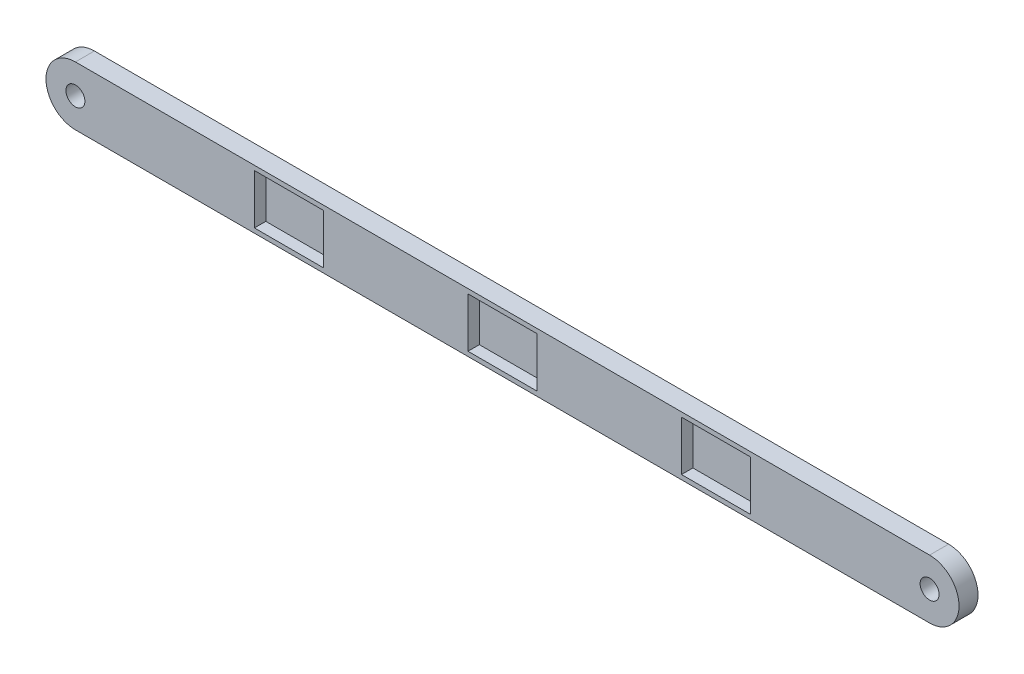
ISO-10303-21;
HEADER;
FILE_DESCRIPTION(('STEP AP214'),'2;1');
FILE_NAME('part.step','',(''),(''),'','','');
FILE_SCHEMA(('AUTOMOTIVE_DESIGN { 1 0 10303 214 1 1 1 1 }'));
ENDSEC;
DATA;
#1=APPLICATION_CONTEXT('core data for automotive mechanical design processes');
#2=APPLICATION_PROTOCOL_DEFINITION('international standard','automotive_design',2000,#1);
#3=PRODUCT_CONTEXT('',#1,'mechanical');
#4=PRODUCT('Part','Part','',(#3));
#5=PRODUCT_RELATED_PRODUCT_CATEGORY('part','',(#4));
#6=PRODUCT_DEFINITION_FORMATION('','',#4);
#7=PRODUCT_DEFINITION_CONTEXT('part definition',#1,'design');
#8=PRODUCT_DEFINITION('design','',#6,#7);
#9=PRODUCT_DEFINITION_SHAPE('','',#8);
#10=(LENGTH_UNIT() NAMED_UNIT(*) SI_UNIT(.MILLI.,.METRE.));
#11=(NAMED_UNIT(*) PLANE_ANGLE_UNIT() SI_UNIT($,.RADIAN.));
#12=(NAMED_UNIT(*) SI_UNIT($,.STERADIAN.) SOLID_ANGLE_UNIT());
#13=UNCERTAINTY_MEASURE_WITH_UNIT(LENGTH_MEASURE(1.E-05),#10,'distance_accuracy_value','');
#14=(GEOMETRIC_REPRESENTATION_CONTEXT(3) GLOBAL_UNCERTAINTY_ASSIGNED_CONTEXT((#13)) GLOBAL_UNIT_ASSIGNED_CONTEXT((#10,
#11,#12)) REPRESENTATION_CONTEXT('',''));
#15=CARTESIAN_POINT('',(0.,0.,0.));
#16=DIRECTION('',(0.,0.,1.));
#17=DIRECTION('',(1.,0.,0.));
#18=AXIS2_PLACEMENT_3D('',#15,#16,#17);
#19=CARTESIAN_POINT('',(-112.5,0.,2.5));
#20=DIRECTION('',(0.,0.,1.));
#21=DIRECTION('',(1.,0.,0.));
#22=AXIS2_PLACEMENT_3D('',#19,#20,#21);
#23=PLANE('',#22);
#24=DIRECTION('',(0.,-1.,0.));
#25=VECTOR('',#24,1.);
#26=CARTESIAN_POINT('',(-65.35,6.55,2.5));
#27=LINE('',#26,#25);
#28=CARTESIAN_POINT('',(-65.35,6.55,2.5));
#29=VERTEX_POINT('',#28);
#30=CARTESIAN_POINT('',(-65.35,-6.55,2.5));
#31=VERTEX_POINT('',#30);
#32=EDGE_CURVE('E58',#29,#31,#27,.T.);
#33=ORIENTED_EDGE('',*,*,#32,.F.);
#34=DIRECTION('',(1.,0.,0.));
#35=VECTOR('',#34,1.);
#36=CARTESIAN_POINT('',(-65.35,6.55,2.5));
#37=LINE('',#36,#35);
#38=CARTESIAN_POINT('',(-47.15,6.55,2.5));
#39=VERTEX_POINT('',#38);
#40=EDGE_CURVE('E176',#29,#39,#37,.T.);
#41=ORIENTED_EDGE('',*,*,#40,.T.);
#42=DIRECTION('',(0.,-1.,0.));
#43=VECTOR('',#42,1.);
#44=CARTESIAN_POINT('',(-47.15,6.55,2.5));
#45=LINE('',#44,#43);
#46=CARTESIAN_POINT('',(-47.15,-6.55,2.5));
#47=VERTEX_POINT('',#46);
#48=EDGE_CURVE('E179',#39,#47,#45,.T.);
#49=ORIENTED_EDGE('',*,*,#48,.T.);
#50=DIRECTION('',(1.,0.,0.));
#51=VECTOR('',#50,1.);
#52=CARTESIAN_POINT('',(-65.35,-6.55,2.5));
#53=LINE('',#52,#51);
#54=EDGE_CURVE('E185',#31,#47,#53,.T.);
#55=ORIENTED_EDGE('',*,*,#54,.F.);
#56=EDGE_LOOP('',(#33,#41,#49,#55));
#57=FACE_BOUND('',#56,.T.);
#58=DIRECTION('',(1.,0.,0.));
#59=VECTOR('',#58,1.);
#60=CARTESIAN_POINT('',(-9.1,-6.55,2.5));
#61=LINE('',#60,#59);
#62=CARTESIAN_POINT('',(-9.1,-6.55,2.5));
#63=VERTEX_POINT('',#62);
#64=CARTESIAN_POINT('',(9.1,-6.55,2.5));
#65=VERTEX_POINT('',#64);
#66=EDGE_CURVE('E66',#63,#65,#61,.T.);
#67=ORIENTED_EDGE('',*,*,#66,.F.);
#68=DIRECTION('',(0.,-1.,0.));
#69=VECTOR('',#68,1.);
#70=CARTESIAN_POINT('',(-9.1,6.55,2.5));
#71=LINE('',#70,#69);
#72=CARTESIAN_POINT('',(-9.1,6.55,2.5));
#73=VERTEX_POINT('',#72);
#74=EDGE_CURVE('E205',#73,#63,#71,.T.);
#75=ORIENTED_EDGE('',*,*,#74,.F.);
#76=DIRECTION('',(1.,0.,0.));
#77=VECTOR('',#76,1.);
#78=CARTESIAN_POINT('',(-9.1,6.55,2.5));
#79=LINE('',#78,#77);
#80=CARTESIAN_POINT('',(9.1,6.55,2.5));
#81=VERTEX_POINT('',#80);
#82=EDGE_CURVE('E208',#73,#81,#79,.T.);
#83=ORIENTED_EDGE('',*,*,#82,.T.);
#84=DIRECTION('',(0.,-1.,0.));
#85=VECTOR('',#84,1.);
#86=CARTESIAN_POINT('',(9.1,6.55,2.5));
#87=LINE('',#86,#85);
#88=EDGE_CURVE('E212',#81,#65,#87,.T.);
#89=ORIENTED_EDGE('',*,*,#88,.T.);
#90=EDGE_LOOP('',(#67,#75,#83,#89));
#91=FACE_BOUND('',#90,.T.);
#92=DIRECTION('',(1.,0.,0.));
#93=VECTOR('',#92,1.);
#94=CARTESIAN_POINT('',(47.15,-6.55,2.5));
#95=LINE('',#94,#93);
#96=CARTESIAN_POINT('',(47.15,-6.55,2.5));
#97=VERTEX_POINT('',#96);
#98=CARTESIAN_POINT('',(65.35,-6.55,2.5));
#99=VERTEX_POINT('',#98);
#100=EDGE_CURVE('E204',#97,#99,#95,.T.);
#101=ORIENTED_EDGE('',*,*,#100,.F.);
#102=DIRECTION('',(0.,-1.,0.));
#103=VECTOR('',#102,1.);
#104=CARTESIAN_POINT('',(47.15,6.55,2.5));
#105=LINE('',#104,#103);
#106=CARTESIAN_POINT('',(47.15,6.55,2.5));
#107=VERTEX_POINT('',#106);
#108=EDGE_CURVE('E234',#107,#97,#105,.T.);
#109=ORIENTED_EDGE('',*,*,#108,.F.);
#110=DIRECTION('',(1.,0.,0.));
#111=VECTOR('',#110,1.);
#112=CARTESIAN_POINT('',(47.15,6.55,2.5));
#113=LINE('',#112,#111);
#114=CARTESIAN_POINT('',(65.35,6.55,2.5));
#115=VERTEX_POINT('',#114);
#116=EDGE_CURVE('E237',#107,#115,#113,.T.);
#117=ORIENTED_EDGE('',*,*,#116,.T.);
#118=DIRECTION('',(0.,-1.,0.));
#119=VECTOR('',#118,1.);
#120=CARTESIAN_POINT('',(65.35,6.55,2.5));
#121=LINE('',#120,#119);
#122=EDGE_CURVE('E241',#115,#99,#121,.T.);
#123=ORIENTED_EDGE('',*,*,#122,.T.);
#124=EDGE_LOOP('',(#101,#109,#117,#123));
#125=FACE_BOUND('',#124,.T.);
#126=CARTESIAN_POINT('',(112.5,0.,2.5));
#127=DIRECTION('',(0.,0.,1.));
#128=DIRECTION('',(1.,0.,0.));
#129=AXIS2_PLACEMENT_3D('',#126,#127,#128);
#130=CIRCLE('',#129,2.49999999999999);
#131=CARTESIAN_POINT('',(115.,0.,2.5));
#132=VERTEX_POINT('',#131);
#133=EDGE_CURVE('E259',#132,#132,#130,.T.);
#134=ORIENTED_EDGE('',*,*,#133,.F.);
#135=EDGE_LOOP('',(#134));
#136=FACE_BOUND('',#135,.T.);
#137=CARTESIAN_POINT('',(-112.5,0.,2.5));
#138=DIRECTION('',(0.,0.,1.));
#139=DIRECTION('',(1.,0.,0.));
#140=AXIS2_PLACEMENT_3D('',#137,#138,#139);
#141=CIRCLE('',#140,7.75);
#142=CARTESIAN_POINT('',(-112.5,7.75,2.5));
#143=VERTEX_POINT('',#142);
#144=CARTESIAN_POINT('',(-112.5,-7.75,2.5));
#145=VERTEX_POINT('',#144);
#146=EDGE_CURVE('E265',#143,#145,#141,.T.);
#147=ORIENTED_EDGE('',*,*,#146,.T.);
#148=DIRECTION('',(1.,0.,0.));
#149=VECTOR('',#148,1.);
#150=CARTESIAN_POINT('',(-112.5,-7.75,2.5));
#151=LINE('',#150,#149);
#152=CARTESIAN_POINT('',(112.5,-7.74999999999996,2.5));
#153=VERTEX_POINT('',#152);
#154=EDGE_CURVE('E268',#145,#153,#151,.T.);
#155=ORIENTED_EDGE('',*,*,#154,.T.);
#156=CARTESIAN_POINT('',(112.5,0.,2.5));
#157=DIRECTION('',(0.,0.,1.));
#158=DIRECTION('',(1.,0.,0.));
#159=AXIS2_PLACEMENT_3D('',#156,#157,#158);
#160=CIRCLE('',#159,7.75);
#161=CARTESIAN_POINT('',(112.5,7.75,2.5));
#162=VERTEX_POINT('',#161);
#163=EDGE_CURVE('E271',#153,#162,#160,.T.);
#164=ORIENTED_EDGE('',*,*,#163,.T.);
#165=DIRECTION('',(-1.,0.,0.));
#166=VECTOR('',#165,1.);
#167=CARTESIAN_POINT('',(-112.5,7.75,2.5));
#168=LINE('',#167,#166);
#169=EDGE_CURVE('E273',#162,#143,#168,.T.);
#170=ORIENTED_EDGE('',*,*,#169,.T.);
#171=EDGE_LOOP('',(#147,#155,#164,#170));
#172=FACE_BOUND('',#171,.T.);
#173=CARTESIAN_POINT('',(-112.5,0.,2.5));
#174=DIRECTION('',(0.,0.,1.));
#175=DIRECTION('',(1.,0.,0.));
#176=AXIS2_PLACEMENT_3D('',#173,#174,#175);
#177=CIRCLE('',#176,2.50000000000001);
#178=CARTESIAN_POINT('',(-110.,0.,2.5));
#179=VERTEX_POINT('',#178);
#180=EDGE_CURVE('E253',#179,#179,#177,.T.);
#181=ORIENTED_EDGE('',*,*,#180,.F.);
#182=EDGE_LOOP('',(#181));
#183=FACE_BOUND('',#182,.T.);
#184=ADVANCED_FACE('F43',(#57,#91,#125,#136,#172,#183),#23,.T.);
#185=CARTESIAN_POINT('',(-112.5,0.,-2.5));
#186=DIRECTION('',(0.,0.,1.));
#187=DIRECTION('',(1.,0.,0.));
#188=AXIS2_PLACEMENT_3D('',#185,#186,#187);
#189=PLANE('',#188);
#190=CARTESIAN_POINT('',(-112.5,0.,-2.5));
#191=DIRECTION('',(0.,0.,1.));
#192=DIRECTION('',(1.,0.,0.));
#193=AXIS2_PLACEMENT_3D('',#190,#191,#192);
#194=CIRCLE('',#193,7.75);
#195=CARTESIAN_POINT('',(-112.5,7.75,-2.5));
#196=VERTEX_POINT('',#195);
#197=CARTESIAN_POINT('',(-112.5,-7.75,-2.5));
#198=VERTEX_POINT('',#197);
#199=EDGE_CURVE('E262',#196,#198,#194,.T.);
#200=ORIENTED_EDGE('',*,*,#199,.F.);
#201=DIRECTION('',(-1.,0.,0.));
#202=VECTOR('',#201,1.);
#203=CARTESIAN_POINT('',(-112.5,7.75,-2.5));
#204=LINE('',#203,#202);
#205=CARTESIAN_POINT('',(112.5,7.75,-2.5));
#206=VERTEX_POINT('',#205);
#207=EDGE_CURVE('E269',#206,#196,#204,.T.);
#208=ORIENTED_EDGE('',*,*,#207,.F.);
#209=CARTESIAN_POINT('',(112.5,0.,-2.5));
#210=DIRECTION('',(0.,0.,1.));
#211=DIRECTION('',(1.,0.,0.));
#212=AXIS2_PLACEMENT_3D('',#209,#210,#211);
#213=CIRCLE('',#212,7.75);
#214=CARTESIAN_POINT('',(112.5,-7.74999999999996,-2.5));
#215=VERTEX_POINT('',#214);
#216=EDGE_CURVE('E280',#215,#206,#213,.T.);
#217=ORIENTED_EDGE('',*,*,#216,.F.);
#218=DIRECTION('',(1.,0.,0.));
#219=VECTOR('',#218,1.);
#220=CARTESIAN_POINT('',(-112.5,-7.75,-2.5));
#221=LINE('',#220,#219);
#222=EDGE_CURVE('E278',#198,#215,#221,.T.);
#223=ORIENTED_EDGE('',*,*,#222,.F.);
#224=EDGE_LOOP('',(#200,#208,#217,#223));
#225=FACE_BOUND('',#224,.T.);
#226=CARTESIAN_POINT('',(112.5,0.,-2.5));
#227=DIRECTION('',(0.,0.,1.));
#228=DIRECTION('',(1.,0.,0.));
#229=AXIS2_PLACEMENT_3D('',#226,#227,#228);
#230=CIRCLE('',#229,2.49999999999999);
#231=CARTESIAN_POINT('',(115.,0.,-2.5));
#232=VERTEX_POINT('',#231);
#233=EDGE_CURVE('E256',#232,#232,#230,.T.);
#234=ORIENTED_EDGE('',*,*,#233,.T.);
#235=EDGE_LOOP('',(#234));
#236=FACE_BOUND('',#235,.T.);
#237=CARTESIAN_POINT('',(-112.5,0.,-2.5));
#238=DIRECTION('',(0.,0.,1.));
#239=DIRECTION('',(1.,0.,0.));
#240=AXIS2_PLACEMENT_3D('',#237,#238,#239);
#241=CIRCLE('',#240,2.50000000000001);
#242=CARTESIAN_POINT('',(-110.,0.,-2.5));
#243=VERTEX_POINT('',#242);
#244=EDGE_CURVE('E191',#243,#243,#241,.T.);
#245=ORIENTED_EDGE('',*,*,#244,.T.);
#246=EDGE_LOOP('',(#245));
#247=FACE_BOUND('',#246,.T.);
#248=ADVANCED_FACE('F298',(#225,#236,#247),#189,.F.);
#249=CARTESIAN_POINT('',(-112.5,0.,2.5));
#250=DIRECTION('',(0.,0.,-1.));
#251=DIRECTION('',(-1.,0.,0.));
#252=AXIS2_PLACEMENT_3D('',#249,#250,#251);
#253=CYLINDRICAL_SURFACE('',#252,7.75);
#254=ORIENTED_EDGE('',*,*,#199,.T.);
#255=DIRECTION('',(0.,0.,-1.));
#256=VECTOR('',#255,1.);
#257=CARTESIAN_POINT('',(-112.5,-7.75,2.5));
#258=LINE('',#257,#256);
#259=EDGE_CURVE('E11',#145,#198,#258,.T.);
#260=ORIENTED_EDGE('',*,*,#259,.F.);
#261=ORIENTED_EDGE('',*,*,#146,.F.);
#262=DIRECTION('',(0.,0.,-1.));
#263=VECTOR('',#262,1.);
#264=CARTESIAN_POINT('',(-112.5,7.75,2.5));
#265=LINE('',#264,#263);
#266=EDGE_CURVE('E275',#143,#196,#265,.T.);
#267=ORIENTED_EDGE('',*,*,#266,.T.);
#268=EDGE_LOOP('',(#254,#260,#261,#267));
#269=FACE_BOUND('',#268,.T.);
#270=ADVANCED_FACE('F45',(#269),#253,.T.);
#271=CARTESIAN_POINT('',(-112.5,-7.75,2.5));
#272=DIRECTION('',(0.,1.,0.));
#273=DIRECTION('',(0.,0.,1.));
#274=AXIS2_PLACEMENT_3D('',#271,#272,#273);
#275=PLANE('',#274);
#276=ORIENTED_EDGE('',*,*,#222,.T.);
#277=DIRECTION('',(0.,0.,-1.));
#278=VECTOR('',#277,1.);
#279=CARTESIAN_POINT('',(112.5,-7.74999999999996,2.5));
#280=LINE('',#279,#278);
#281=EDGE_CURVE('E51',#153,#215,#280,.T.);
#282=ORIENTED_EDGE('',*,*,#281,.F.);
#283=ORIENTED_EDGE('',*,*,#154,.F.);
#284=ORIENTED_EDGE('',*,*,#259,.T.);
#285=EDGE_LOOP('',(#276,#282,#283,#284));
#286=FACE_BOUND('',#285,.T.);
#287=ADVANCED_FACE('F309',(#286),#275,.F.);
#288=CARTESIAN_POINT('',(112.5,0.,2.5));
#289=DIRECTION('',(0.,0.,-1.));
#290=DIRECTION('',(-1.,0.,0.));
#291=AXIS2_PLACEMENT_3D('',#288,#289,#290);
#292=CYLINDRICAL_SURFACE('',#291,7.75);
#293=ORIENTED_EDGE('',*,*,#216,.T.);
#294=DIRECTION('',(0.,0.,-1.));
#295=VECTOR('',#294,1.);
#296=CARTESIAN_POINT('',(112.5,7.75,2.5));
#297=LINE('',#296,#295);
#298=EDGE_CURVE('E285',#162,#206,#297,.T.);
#299=ORIENTED_EDGE('',*,*,#298,.F.);
#300=ORIENTED_EDGE('',*,*,#163,.F.);
#301=ORIENTED_EDGE('',*,*,#281,.T.);
#302=EDGE_LOOP('',(#293,#299,#300,#301));
#303=FACE_BOUND('',#302,.T.);
#304=ADVANCED_FACE('F292',(#303),#292,.T.);
#305=CARTESIAN_POINT('',(-112.5,7.75,2.5));
#306=DIRECTION('',(0.,-1.,0.));
#307=DIRECTION('',(0.,0.,-1.));
#308=AXIS2_PLACEMENT_3D('',#305,#306,#307);
#309=PLANE('',#308);
#310=ORIENTED_EDGE('',*,*,#207,.T.);
#311=ORIENTED_EDGE('',*,*,#266,.F.);
#312=ORIENTED_EDGE('',*,*,#169,.F.);
#313=ORIENTED_EDGE('',*,*,#298,.T.);
#314=EDGE_LOOP('',(#310,#311,#312,#313));
#315=FACE_BOUND('',#314,.T.);
#316=ADVANCED_FACE('F302',(#315),#309,.F.);
#317=CARTESIAN_POINT('',(112.5,0.,2.5));
#318=DIRECTION('',(0.,0.,-1.));
#319=DIRECTION('',(-1.,0.,0.));
#320=AXIS2_PLACEMENT_3D('',#317,#318,#319);
#321=CYLINDRICAL_SURFACE('',#320,2.49999999999999);
#322=ORIENTED_EDGE('',*,*,#133,.T.);
#323=EDGE_LOOP('',(#322));
#324=FACE_BOUND('',#323,.T.);
#325=ORIENTED_EDGE('',*,*,#233,.F.);
#326=EDGE_LOOP('',(#325));
#327=FACE_BOUND('',#326,.T.);
#328=ADVANCED_FACE('F327',(#324,#327),#321,.F.);
#329=CARTESIAN_POINT('',(-112.5,0.,2.5));
#330=DIRECTION('',(0.,0.,-1.));
#331=DIRECTION('',(-1.,0.,0.));
#332=AXIS2_PLACEMENT_3D('',#329,#330,#331);
#333=CYLINDRICAL_SURFACE('',#332,2.50000000000001);
#334=ORIENTED_EDGE('',*,*,#180,.T.);
#335=EDGE_LOOP('',(#334));
#336=FACE_BOUND('',#335,.T.);
#337=ORIENTED_EDGE('',*,*,#244,.F.);
#338=EDGE_LOOP('',(#337));
#339=FACE_BOUND('',#338,.T.);
#340=ADVANCED_FACE('F334',(#336,#339),#333,.F.);
#341=CARTESIAN_POINT('',(47.15,-6.55,-0.5));
#342=DIRECTION('',(0.,-1.,0.));
#343=DIRECTION('',(0.,0.,-1.));
#344=AXIS2_PLACEMENT_3D('',#341,#342,#343);
#345=PLANE('',#344);
#346=ORIENTED_EDGE('',*,*,#100,.T.);
#347=DIRECTION('',(0.,0.,1.));
#348=VECTOR('',#347,1.);
#349=CARTESIAN_POINT('',(65.35,-6.55,-0.5));
#350=LINE('',#349,#348);
#351=CARTESIAN_POINT('',(65.35,-6.55,-0.5));
#352=VERTEX_POINT('',#351);
#353=EDGE_CURVE('E224',#352,#99,#350,.T.);
#354=ORIENTED_EDGE('',*,*,#353,.F.);
#355=DIRECTION('',(1.,0.,0.));
#356=VECTOR('',#355,1.);
#357=CARTESIAN_POINT('',(47.15,-6.55,-0.5));
#358=LINE('',#357,#356);
#359=CARTESIAN_POINT('',(47.15,-6.55,-0.5));
#360=VERTEX_POINT('',#359);
#361=EDGE_CURVE('E238',#360,#352,#358,.T.);
#362=ORIENTED_EDGE('',*,*,#361,.F.);
#363=DIRECTION('',(0.,0.,1.));
#364=VECTOR('',#363,1.);
#365=CARTESIAN_POINT('',(47.15,-6.55,-0.5));
#366=LINE('',#365,#364);
#367=EDGE_CURVE('E232',#360,#97,#366,.T.);
#368=ORIENTED_EDGE('',*,*,#367,.T.);
#369=EDGE_LOOP('',(#346,#354,#362,#368));
#370=FACE_BOUND('',#369,.T.);
#371=ADVANCED_FACE('F338',(#370),#345,.F.);
#372=CARTESIAN_POINT('',(47.15,6.55,-0.5));
#373=DIRECTION('',(-1.,0.,0.));
#374=DIRECTION('',(0.,0.,1.));
#375=AXIS2_PLACEMENT_3D('',#372,#373,#374);
#376=PLANE('',#375);
#377=ORIENTED_EDGE('',*,*,#108,.T.);
#378=ORIENTED_EDGE('',*,*,#367,.F.);
#379=DIRECTION('',(0.,-1.,0.));
#380=VECTOR('',#379,1.);
#381=CARTESIAN_POINT('',(47.15,6.55,-0.5));
#382=LINE('',#381,#380);
#383=CARTESIAN_POINT('',(47.15,6.55,-0.5));
#384=VERTEX_POINT('',#383);
#385=EDGE_CURVE('E227',#384,#360,#382,.T.);
#386=ORIENTED_EDGE('',*,*,#385,.F.);
#387=DIRECTION('',(0.,0.,1.));
#388=VECTOR('',#387,1.);
#389=CARTESIAN_POINT('',(47.15,6.55,-0.5));
#390=LINE('',#389,#388);
#391=EDGE_CURVE('E230',#384,#107,#390,.T.);
#392=ORIENTED_EDGE('',*,*,#391,.T.);
#393=EDGE_LOOP('',(#377,#378,#386,#392));
#394=FACE_BOUND('',#393,.T.);
#395=ADVANCED_FACE('F349',(#394),#376,.F.);
#396=CARTESIAN_POINT('',(47.15,6.55,-0.5));
#397=DIRECTION('',(0.,-1.,0.));
#398=DIRECTION('',(0.,0.,-1.));
#399=AXIS2_PLACEMENT_3D('',#396,#397,#398);
#400=PLANE('',#399);
#401=ORIENTED_EDGE('',*,*,#116,.F.);
#402=ORIENTED_EDGE('',*,*,#391,.F.);
#403=DIRECTION('',(1.,0.,0.));
#404=VECTOR('',#403,1.);
#405=CARTESIAN_POINT('',(47.15,6.55,-0.5));
#406=LINE('',#405,#404);
#407=CARTESIAN_POINT('',(65.35,6.55,-0.5));
#408=VERTEX_POINT('',#407);
#409=EDGE_CURVE('E247',#384,#408,#406,.T.);
#410=ORIENTED_EDGE('',*,*,#409,.T.);
#411=DIRECTION('',(0.,0.,1.));
#412=VECTOR('',#411,1.);
#413=CARTESIAN_POINT('',(65.35,6.55,-0.5));
#414=LINE('',#413,#412);
#415=EDGE_CURVE('E228',#408,#115,#414,.T.);
#416=ORIENTED_EDGE('',*,*,#415,.T.);
#417=EDGE_LOOP('',(#401,#402,#410,#416));
#418=FACE_BOUND('',#417,.T.);
#419=ADVANCED_FACE('F361',(#418),#400,.T.);
#420=CARTESIAN_POINT('',(65.35,6.55,-0.5));
#421=DIRECTION('',(-1.,0.,0.));
#422=DIRECTION('',(0.,0.,1.));
#423=AXIS2_PLACEMENT_3D('',#420,#421,#422);
#424=PLANE('',#423);
#425=ORIENTED_EDGE('',*,*,#122,.F.);
#426=ORIENTED_EDGE('',*,*,#415,.F.);
#427=DIRECTION('',(0.,-1.,0.));
#428=VECTOR('',#427,1.);
#429=CARTESIAN_POINT('',(65.35,6.55,-0.5));
#430=LINE('',#429,#428);
#431=EDGE_CURVE('E249',#408,#352,#430,.T.);
#432=ORIENTED_EDGE('',*,*,#431,.T.);
#433=ORIENTED_EDGE('',*,*,#353,.T.);
#434=EDGE_LOOP('',(#425,#426,#432,#433));
#435=FACE_BOUND('',#434,.T.);
#436=ADVANCED_FACE('F357',(#435),#424,.T.);
#437=CARTESIAN_POINT('',(0.,0.,-0.5));
#438=DIRECTION('',(0.,0.,-1.));
#439=DIRECTION('',(-1.,0.,0.));
#440=AXIS2_PLACEMENT_3D('',#437,#438,#439);
#441=PLANE('',#440);
#442=ORIENTED_EDGE('',*,*,#361,.T.);
#443=ORIENTED_EDGE('',*,*,#431,.F.);
#444=ORIENTED_EDGE('',*,*,#409,.F.);
#445=ORIENTED_EDGE('',*,*,#385,.T.);
#446=EDGE_LOOP('',(#442,#443,#444,#445));
#447=FACE_BOUND('',#446,.T.);
#448=ADVANCED_FACE('F353',(#447),#441,.F.);
#449=CARTESIAN_POINT('',(-9.1,-6.55,-0.5));
#450=DIRECTION('',(0.,-1.,0.));
#451=DIRECTION('',(0.,0.,-1.));
#452=AXIS2_PLACEMENT_3D('',#449,#450,#451);
#453=PLANE('',#452);
#454=ORIENTED_EDGE('',*,*,#66,.T.);
#455=DIRECTION('',(0.,0.,1.));
#456=VECTOR('',#455,1.);
#457=CARTESIAN_POINT('',(9.1,-6.55,-0.5));
#458=LINE('',#457,#456);
#459=CARTESIAN_POINT('',(9.1,-6.55,-0.5));
#460=VERTEX_POINT('',#459);
#461=EDGE_CURVE('E195',#460,#65,#458,.T.);
#462=ORIENTED_EDGE('',*,*,#461,.F.);
#463=DIRECTION('',(1.,0.,0.));
#464=VECTOR('',#463,1.);
#465=CARTESIAN_POINT('',(-9.1,-6.55,-0.5));
#466=LINE('',#465,#464);
#467=CARTESIAN_POINT('',(-9.1,-6.55,-0.5));
#468=VERTEX_POINT('',#467);
#469=EDGE_CURVE('E209',#468,#460,#466,.T.);
#470=ORIENTED_EDGE('',*,*,#469,.F.);
#471=DIRECTION('',(0.,0.,1.));
#472=VECTOR('',#471,1.);
#473=CARTESIAN_POINT('',(-9.1,-6.55,-0.5));
#474=LINE('',#473,#472);
#475=EDGE_CURVE('E202',#468,#63,#474,.T.);
#476=ORIENTED_EDGE('',*,*,#475,.T.);
#477=EDGE_LOOP('',(#454,#462,#470,#476));
#478=FACE_BOUND('',#477,.T.);
#479=ADVANCED_FACE('F356',(#478),#453,.F.);
#480=CARTESIAN_POINT('',(-9.1,6.55,-0.5));
#481=DIRECTION('',(-1.,0.,0.));
#482=DIRECTION('',(0.,0.,1.));
#483=AXIS2_PLACEMENT_3D('',#480,#481,#482);
#484=PLANE('',#483);
#485=ORIENTED_EDGE('',*,*,#74,.T.);
#486=ORIENTED_EDGE('',*,*,#475,.F.);
#487=DIRECTION('',(0.,-1.,0.));
#488=VECTOR('',#487,1.);
#489=CARTESIAN_POINT('',(-9.1,6.55,-0.5));
#490=LINE('',#489,#488);
#491=CARTESIAN_POINT('',(-9.1,6.55,-0.5));
#492=VERTEX_POINT('',#491);
#493=EDGE_CURVE('E197',#492,#468,#490,.T.);
#494=ORIENTED_EDGE('',*,*,#493,.F.);
#495=DIRECTION('',(0.,0.,1.));
#496=VECTOR('',#495,1.);
#497=CARTESIAN_POINT('',(-9.1,6.55,-0.5));
#498=LINE('',#497,#496);
#499=EDGE_CURVE('E200',#492,#73,#498,.T.);
#500=ORIENTED_EDGE('',*,*,#499,.T.);
#501=EDGE_LOOP('',(#485,#486,#494,#500));
#502=FACE_BOUND('',#501,.T.);
#503=ADVANCED_FACE('F374',(#502),#484,.F.);
#504=CARTESIAN_POINT('',(-9.1,6.55,-0.5));
#505=DIRECTION('',(0.,-1.,0.));
#506=DIRECTION('',(0.,0.,-1.));
#507=AXIS2_PLACEMENT_3D('',#504,#505,#506);
#508=PLANE('',#507);
#509=ORIENTED_EDGE('',*,*,#82,.F.);
#510=ORIENTED_EDGE('',*,*,#499,.F.);
#511=DIRECTION('',(1.,0.,0.));
#512=VECTOR('',#511,1.);
#513=CARTESIAN_POINT('',(-9.1,6.55,-0.5));
#514=LINE('',#513,#512);
#515=CARTESIAN_POINT('',(9.1,6.55,-0.5));
#516=VERTEX_POINT('',#515);
#517=EDGE_CURVE('E218',#492,#516,#514,.T.);
#518=ORIENTED_EDGE('',*,*,#517,.T.);
#519=DIRECTION('',(0.,0.,1.));
#520=VECTOR('',#519,1.);
#521=CARTESIAN_POINT('',(9.1,6.55,-0.5));
#522=LINE('',#521,#520);
#523=EDGE_CURVE('E198',#516,#81,#522,.T.);
#524=ORIENTED_EDGE('',*,*,#523,.T.);
#525=EDGE_LOOP('',(#509,#510,#518,#524));
#526=FACE_BOUND('',#525,.T.);
#527=ADVANCED_FACE('F377',(#526),#508,.T.);
#528=CARTESIAN_POINT('',(9.1,6.55,-0.5));
#529=DIRECTION('',(-1.,0.,0.));
#530=DIRECTION('',(0.,0.,1.));
#531=AXIS2_PLACEMENT_3D('',#528,#529,#530);
#532=PLANE('',#531);
#533=ORIENTED_EDGE('',*,*,#88,.F.);
#534=ORIENTED_EDGE('',*,*,#523,.F.);
#535=DIRECTION('',(0.,-1.,0.));
#536=VECTOR('',#535,1.);
#537=CARTESIAN_POINT('',(9.1,6.55,-0.5));
#538=LINE('',#537,#536);
#539=EDGE_CURVE('E220',#516,#460,#538,.T.);
#540=ORIENTED_EDGE('',*,*,#539,.T.);
#541=ORIENTED_EDGE('',*,*,#461,.T.);
#542=EDGE_LOOP('',(#533,#534,#540,#541));
#543=FACE_BOUND('',#542,.T.);
#544=ADVANCED_FACE('F372',(#543),#532,.T.);
#545=CARTESIAN_POINT('',(0.,0.,-0.5));
#546=DIRECTION('',(0.,0.,-1.));
#547=DIRECTION('',(-1.,0.,0.));
#548=AXIS2_PLACEMENT_3D('',#545,#546,#547);
#549=PLANE('',#548);
#550=ORIENTED_EDGE('',*,*,#469,.T.);
#551=ORIENTED_EDGE('',*,*,#539,.F.);
#552=ORIENTED_EDGE('',*,*,#517,.F.);
#553=ORIENTED_EDGE('',*,*,#493,.T.);
#554=EDGE_LOOP('',(#550,#551,#552,#553));
#555=FACE_BOUND('',#554,.T.);
#556=ADVANCED_FACE('F369',(#555),#549,.F.);
#557=CARTESIAN_POINT('',(-65.35,6.55,-0.5));
#558=DIRECTION('',(-1.,0.,0.));
#559=DIRECTION('',(0.,0.,1.));
#560=AXIS2_PLACEMENT_3D('',#557,#558,#559);
#561=PLANE('',#560);
#562=ORIENTED_EDGE('',*,*,#32,.T.);
#563=DIRECTION('',(0.,0.,1.));
#564=VECTOR('',#563,1.);
#565=CARTESIAN_POINT('',(-65.35,-6.55,-0.5));
#566=LINE('',#565,#564);
#567=CARTESIAN_POINT('',(-65.35,-6.55,-0.5));
#568=VERTEX_POINT('',#567);
#569=EDGE_CURVE('E155',#568,#31,#566,.T.);
#570=ORIENTED_EDGE('',*,*,#569,.F.);
#571=DIRECTION('',(0.,-1.,0.));
#572=VECTOR('',#571,1.);
#573=CARTESIAN_POINT('',(-65.35,6.55,-0.5));
#574=LINE('',#573,#572);
#575=CARTESIAN_POINT('',(-65.35,6.55,-0.5));
#576=VERTEX_POINT('',#575);
#577=EDGE_CURVE('E159',#576,#568,#574,.T.);
#578=ORIENTED_EDGE('',*,*,#577,.F.);
#579=DIRECTION('',(0.,0.,1.));
#580=VECTOR('',#579,1.);
#581=CARTESIAN_POINT('',(-65.35,6.55,-0.5));
#582=LINE('',#581,#580);
#583=EDGE_CURVE('E189',#576,#29,#582,.T.);
#584=ORIENTED_EDGE('',*,*,#583,.T.);
#585=EDGE_LOOP('',(#562,#570,#578,#584));
#586=FACE_BOUND('',#585,.T.);
#587=ADVANCED_FACE('F157',(#586),#561,.F.);
#588=CARTESIAN_POINT('',(-65.35,6.55,-0.5));
#589=DIRECTION('',(0.,-1.,0.));
#590=DIRECTION('',(0.,0.,-1.));
#591=AXIS2_PLACEMENT_3D('',#588,#589,#590);
#592=PLANE('',#591);
#593=ORIENTED_EDGE('',*,*,#40,.F.);
#594=ORIENTED_EDGE('',*,*,#583,.F.);
#595=DIRECTION('',(1.,0.,0.));
#596=VECTOR('',#595,1.);
#597=CARTESIAN_POINT('',(-65.35,6.55,-0.5));
#598=LINE('',#597,#596);
#599=CARTESIAN_POINT('',(-47.15,6.55,-0.5));
#600=VERTEX_POINT('',#599);
#601=EDGE_CURVE('E164',#576,#600,#598,.T.);
#602=ORIENTED_EDGE('',*,*,#601,.T.);
#603=DIRECTION('',(0.,0.,1.));
#604=VECTOR('',#603,1.);
#605=CARTESIAN_POINT('',(-47.15,6.55,-0.5));
#606=LINE('',#605,#604);
#607=EDGE_CURVE('E192',#600,#39,#606,.T.);
#608=ORIENTED_EDGE('',*,*,#607,.T.);
#609=EDGE_LOOP('',(#593,#594,#602,#608));
#610=FACE_BOUND('',#609,.T.);
#611=ADVANCED_FACE('F389',(#610),#592,.T.);
#612=CARTESIAN_POINT('',(-47.15,6.55,-0.5));
#613=DIRECTION('',(-1.,0.,0.));
#614=DIRECTION('',(0.,0.,1.));
#615=AXIS2_PLACEMENT_3D('',#612,#613,#614);
#616=PLANE('',#615);
#617=ORIENTED_EDGE('',*,*,#48,.F.);
#618=ORIENTED_EDGE('',*,*,#607,.F.);
#619=DIRECTION('',(0.,-1.,0.));
#620=VECTOR('',#619,1.);
#621=CARTESIAN_POINT('',(-47.15,6.55,-0.5));
#622=LINE('',#621,#620);
#623=CARTESIAN_POINT('',(-47.15,-6.55,-0.5));
#624=VERTEX_POINT('',#623);
#625=EDGE_CURVE('E172',#600,#624,#622,.T.);
#626=ORIENTED_EDGE('',*,*,#625,.T.);
#627=DIRECTION('',(0.,0.,1.));
#628=VECTOR('',#627,1.);
#629=CARTESIAN_POINT('',(-47.15,-6.55,-0.5));
#630=LINE('',#629,#628);
#631=EDGE_CURVE('E163',#624,#47,#630,.T.);
#632=ORIENTED_EDGE('',*,*,#631,.T.);
#633=EDGE_LOOP('',(#617,#618,#626,#632));
#634=FACE_BOUND('',#633,.T.);
#635=ADVANCED_FACE('F392',(#634),#616,.T.);
#636=CARTESIAN_POINT('',(-65.35,-6.55,-0.5));
#637=DIRECTION('',(0.,-1.,0.));
#638=DIRECTION('',(0.,0.,-1.));
#639=AXIS2_PLACEMENT_3D('',#636,#637,#638);
#640=PLANE('',#639);
#641=ORIENTED_EDGE('',*,*,#54,.T.);
#642=ORIENTED_EDGE('',*,*,#631,.F.);
#643=DIRECTION('',(1.,0.,0.));
#644=VECTOR('',#643,1.);
#645=CARTESIAN_POINT('',(-65.35,-6.55,-0.5));
#646=LINE('',#645,#644);
#647=EDGE_CURVE('E168',#568,#624,#646,.T.);
#648=ORIENTED_EDGE('',*,*,#647,.F.);
#649=ORIENTED_EDGE('',*,*,#569,.T.);
#650=EDGE_LOOP('',(#641,#642,#648,#649));
#651=FACE_BOUND('',#650,.T.);
#652=ADVANCED_FACE('F169',(#651),#640,.F.);
#653=CARTESIAN_POINT('',(0.,0.,-0.5));
#654=DIRECTION('',(0.,0.,1.));
#655=DIRECTION('',(1.,0.,0.));
#656=AXIS2_PLACEMENT_3D('',#653,#654,#655);
#657=PLANE('',#656);
#658=ORIENTED_EDGE('',*,*,#577,.T.);
#659=ORIENTED_EDGE('',*,*,#647,.T.);
#660=ORIENTED_EDGE('',*,*,#625,.F.);
#661=ORIENTED_EDGE('',*,*,#601,.F.);
#662=EDGE_LOOP('',(#658,#659,#660,#661));
#663=FACE_BOUND('',#662,.T.);
#664=ADVANCED_FACE('F175',(#663),#657,.T.);
#665=CLOSED_SHELL('',(#184,#248,#270,#287,#304,#316,#328,#340,#371,#395,#419,#436,#448,#479,
#503,#527,#544,#556,#587,#611,#635,#652,#664));
#666=MANIFOLD_SOLID_BREP('B2',#665);
#667=ADVANCED_BREP_SHAPE_REPRESENTATION('',(#18,#666),#14);
#668=SHAPE_DEFINITION_REPRESENTATION(#9,#667);
ENDSEC;
END-ISO-10303-21;
